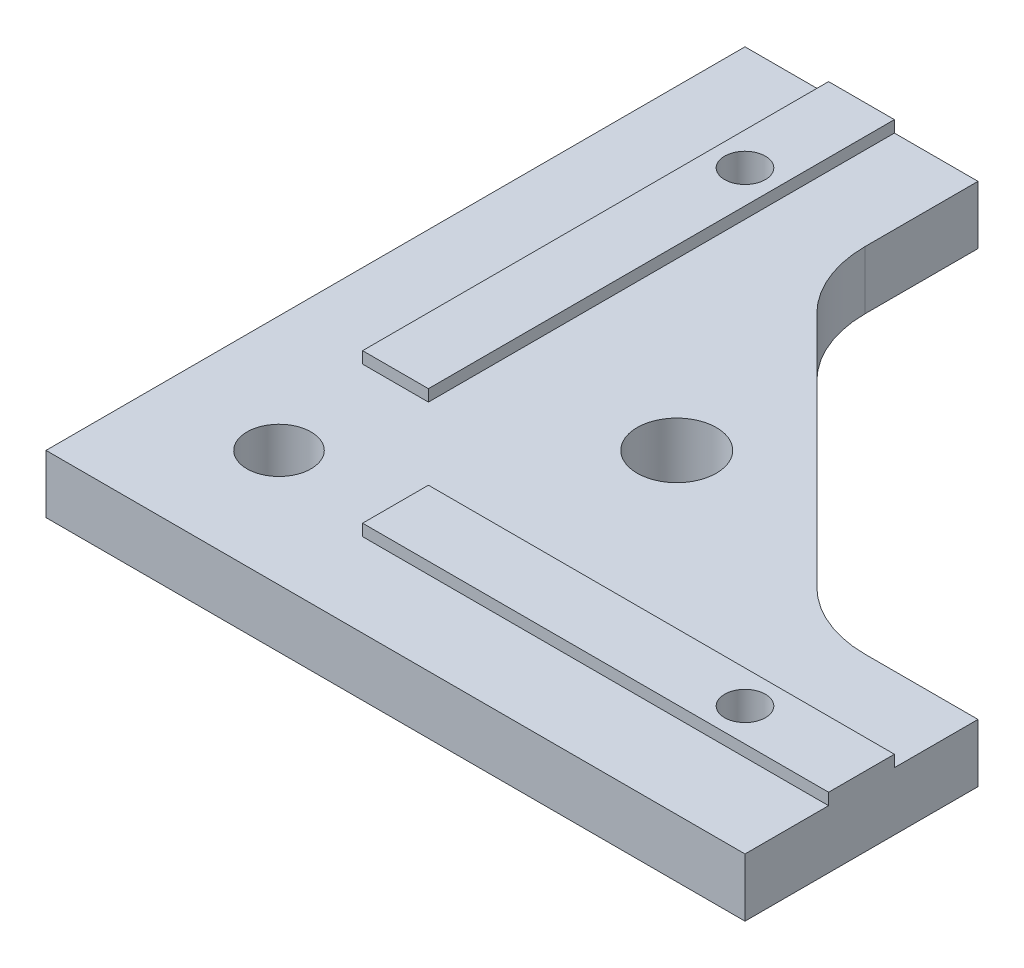
ISO-10303-21;
HEADER;
FILE_DESCRIPTION(('STEP AP214'),'2;1');
FILE_NAME('part.step','',(''),(''),'','','');
FILE_SCHEMA(('AUTOMOTIVE_DESIGN { 1 0 10303 214 1 1 1 1 }'));
ENDSEC;
DATA;
#1=APPLICATION_CONTEXT('core data for automotive mechanical design processes');
#2=APPLICATION_PROTOCOL_DEFINITION('international standard','automotive_design',2000,#1);
#3=PRODUCT_CONTEXT('',#1,'mechanical');
#4=PRODUCT('Part','Part','',(#3));
#5=PRODUCT_RELATED_PRODUCT_CATEGORY('part','',(#4));
#6=PRODUCT_DEFINITION_FORMATION('','',#4);
#7=PRODUCT_DEFINITION_CONTEXT('part definition',#1,'design');
#8=PRODUCT_DEFINITION('design','',#6,#7);
#9=PRODUCT_DEFINITION_SHAPE('','',#8);
#10=(LENGTH_UNIT() NAMED_UNIT(*) SI_UNIT(.MILLI.,.METRE.));
#11=(NAMED_UNIT(*) PLANE_ANGLE_UNIT() SI_UNIT($,.RADIAN.));
#12=(NAMED_UNIT(*) SI_UNIT($,.STERADIAN.) SOLID_ANGLE_UNIT());
#13=UNCERTAINTY_MEASURE_WITH_UNIT(LENGTH_MEASURE(1.E-05),#10,'distance_accuracy_value','');
#14=(GEOMETRIC_REPRESENTATION_CONTEXT(3) GLOBAL_UNCERTAINTY_ASSIGNED_CONTEXT((#13)) GLOBAL_UNIT_ASSIGNED_CONTEXT((#10,
#11,#12)) REPRESENTATION_CONTEXT('',''));
#15=CARTESIAN_POINT('',(0.,0.,0.));
#16=DIRECTION('',(0.,0.,1.));
#17=DIRECTION('',(1.,0.,0.));
#18=AXIS2_PLACEMENT_3D('',#15,#16,#17);
#19=CARTESIAN_POINT('',(0.,5.,0.));
#20=DIRECTION('',(0.,1.,0.));
#21=DIRECTION('',(0.,0.,1.));
#22=AXIS2_PLACEMENT_3D('',#19,#20,#21);
#23=PLANE('',#22);
#24=DIRECTION('',(1.,0.,0.));
#25=VECTOR('',#24,1.);
#26=CARTESIAN_POINT('',(0.,5.,-20.));
#27=LINE('',#26,#25);
#28=CARTESIAN_POINT('',(50.3050865276332,5.,-20.));
#29=VERTEX_POINT('',#28);
#30=CARTESIAN_POINT('',(60.,5.,-20.));
#31=VERTEX_POINT('',#30);
#32=EDGE_CURVE('E219',#29,#31,#27,.T.);
#33=ORIENTED_EDGE('',*,*,#32,.F.);
#34=CARTESIAN_POINT('',(50.3050865276332,5.,-30.));
#35=DIRECTION('',(0.,1.,0.));
#36=DIRECTION('',(0.,0.,1.));
#37=AXIS2_PLACEMENT_3D('',#34,#35,#36);
#38=CIRCLE('',#37,10.);
#39=CARTESIAN_POINT('',(43.2340187157677,5.,-22.9289321881345));
#40=VERTEX_POINT('',#39);
#41=EDGE_CURVE('E284',#29,#40,#38,.F.);
#42=ORIENTED_EDGE('',*,*,#41,.T.);
#43=DIRECTION('',(0.707106781186548,0.,0.707106781186548));
#44=VECTOR('',#43,1.);
#45=CARTESIAN_POINT('',(33.0814754519511,5.,-33.0814754519511));
#46=LINE('',#45,#44);
#47=CARTESIAN_POINT('',(22.9289321881345,5.,-43.2340187157677));
#48=VERTEX_POINT('',#47);
#49=EDGE_CURVE('E409',#48,#40,#46,.T.);
#50=ORIENTED_EDGE('',*,*,#49,.F.);
#51=CARTESIAN_POINT('',(30.,5.,-50.3050865276332));
#52=DIRECTION('',(0.,1.,0.));
#53=DIRECTION('',(0.,0.,1.));
#54=AXIS2_PLACEMENT_3D('',#51,#52,#53);
#55=CIRCLE('',#54,10.);
#56=CARTESIAN_POINT('',(20.,5.,-50.3050865276332));
#57=VERTEX_POINT('',#56);
#58=EDGE_CURVE('E11',#48,#57,#55,.F.);
#59=ORIENTED_EDGE('',*,*,#58,.T.);
#60=DIRECTION('',(0.,0.,1.));
#61=VECTOR('',#60,1.);
#62=CARTESIAN_POINT('',(20.,5.,0.));
#63=LINE('',#62,#61);
#64=CARTESIAN_POINT('',(20.,5.,-60.));
#65=VERTEX_POINT('',#64);
#66=EDGE_CURVE('E222',#65,#57,#63,.T.);
#67=ORIENTED_EDGE('',*,*,#66,.F.);
#68=DIRECTION('',(1.,0.,0.));
#69=VECTOR('',#68,1.);
#70=CARTESIAN_POINT('',(0.,5.,-60.));
#71=LINE('',#70,#69);
#72=CARTESIAN_POINT('',(12.825,5.,-60.));
#73=VERTEX_POINT('',#72);
#74=EDGE_CURVE('E224',#73,#65,#71,.T.);
#75=ORIENTED_EDGE('',*,*,#74,.F.);
#76=DIRECTION('',(0.,0.,1.));
#77=VECTOR('',#76,1.);
#78=CARTESIAN_POINT('',(12.825,5.,0.));
#79=LINE('',#78,#77);
#80=CARTESIAN_POINT('',(12.825,5.,-20.));
#81=VERTEX_POINT('',#80);
#82=EDGE_CURVE('E178',#73,#81,#79,.T.);
#83=ORIENTED_EDGE('',*,*,#82,.T.);
#84=DIRECTION('',(1.,0.,0.));
#85=VECTOR('',#84,1.);
#86=CARTESIAN_POINT('',(0.,5.,-20.));
#87=LINE('',#86,#85);
#88=CARTESIAN_POINT('',(7.17499999999999,5.,-20.));
#89=VERTEX_POINT('',#88);
#90=EDGE_CURVE('E190',#89,#81,#87,.T.);
#91=ORIENTED_EDGE('',*,*,#90,.F.);
#92=DIRECTION('',(0.,0.,1.));
#93=VECTOR('',#92,1.);
#94=CARTESIAN_POINT('',(7.17499999999999,5.,0.));
#95=LINE('',#94,#93);
#96=CARTESIAN_POINT('',(7.17499999999999,5.,-60.));
#97=VERTEX_POINT('',#96);
#98=EDGE_CURVE('E180',#97,#89,#95,.T.);
#99=ORIENTED_EDGE('',*,*,#98,.F.);
#100=CARTESIAN_POINT('',(0.,5.,-60.));
#101=VERTEX_POINT('',#100);
#102=EDGE_CURVE('E225',#101,#97,#71,.T.);
#103=ORIENTED_EDGE('',*,*,#102,.F.);
#104=DIRECTION('',(0.,0.,-1.));
#105=VECTOR('',#104,1.);
#106=CARTESIAN_POINT('',(0.,5.,0.));
#107=LINE('',#106,#105);
#108=CARTESIAN_POINT('',(0.,5.,0.));
#109=VERTEX_POINT('',#108);
#110=EDGE_CURVE('E228',#109,#101,#107,.T.);
#111=ORIENTED_EDGE('',*,*,#110,.F.);
#112=DIRECTION('',(-1.,0.,0.));
#113=VECTOR('',#112,1.);
#114=CARTESIAN_POINT('',(0.,5.,0.));
#115=LINE('',#114,#113);
#116=CARTESIAN_POINT('',(60.,5.,0.));
#117=VERTEX_POINT('',#116);
#118=EDGE_CURVE('E231',#117,#109,#115,.T.);
#119=ORIENTED_EDGE('',*,*,#118,.F.);
#120=DIRECTION('',(0.,0.,1.));
#121=VECTOR('',#120,1.);
#122=CARTESIAN_POINT('',(60.,5.,0.));
#123=LINE('',#122,#121);
#124=CARTESIAN_POINT('',(60.,5.,-7.17499999999999));
#125=VERTEX_POINT('',#124);
#126=EDGE_CURVE('E234',#125,#117,#123,.T.);
#127=ORIENTED_EDGE('',*,*,#126,.F.);
#128=DIRECTION('',(1.,0.,0.));
#129=VECTOR('',#128,1.);
#130=CARTESIAN_POINT('',(0.,5.,-7.17499999999999));
#131=LINE('',#130,#129);
#132=CARTESIAN_POINT('',(20.,5.,-7.17499999999999));
#133=VERTEX_POINT('',#132);
#134=EDGE_CURVE('E332',#133,#125,#131,.T.);
#135=ORIENTED_EDGE('',*,*,#134,.F.);
#136=DIRECTION('',(0.,0.,1.));
#137=VECTOR('',#136,1.);
#138=CARTESIAN_POINT('',(20.,5.,0.));
#139=LINE('',#138,#137);
#140=CARTESIAN_POINT('',(20.,5.,-12.825));
#141=VERTEX_POINT('',#140);
#142=EDGE_CURVE('E176',#141,#133,#139,.T.);
#143=ORIENTED_EDGE('',*,*,#142,.F.);
#144=DIRECTION('',(1.,0.,0.));
#145=VECTOR('',#144,1.);
#146=CARTESIAN_POINT('',(0.,5.,-12.825));
#147=LINE('',#146,#145);
#148=CARTESIAN_POINT('',(60.,5.,-12.825));
#149=VERTEX_POINT('',#148);
#150=EDGE_CURVE('E337',#141,#149,#147,.T.);
#151=ORIENTED_EDGE('',*,*,#150,.T.);
#152=EDGE_CURVE('E235',#31,#149,#123,.T.);
#153=ORIENTED_EDGE('',*,*,#152,.F.);
#154=EDGE_LOOP('',(#33,#42,#50,#59,#67,#75,#83,#91,#99,#103,#111,#119,#127,#135,#143,#151,#153));
#155=FACE_BOUND('',#154,.T.);
#156=CARTESIAN_POINT('',(10.,5.,-10.));
#157=DIRECTION('',(0.,1.,0.));
#158=DIRECTION('',(0.,0.,1.));
#159=AXIS2_PLACEMENT_3D('',#156,#157,#158);
#160=CIRCLE('',#159,2.75);
#161=CARTESIAN_POINT('',(10.,5.,-7.25));
#162=VERTEX_POINT('',#161);
#163=EDGE_CURVE('E216',#162,#162,#160,.T.);
#164=ORIENTED_EDGE('',*,*,#163,.F.);
#165=EDGE_LOOP('',(#164));
#166=FACE_BOUND('',#165,.T.);
#167=CARTESIAN_POINT('',(27.0710678118655,5.,-27.0710678118655));
#168=DIRECTION('',(0.,1.,0.));
#169=DIRECTION('',(0.,0.,1.));
#170=AXIS2_PLACEMENT_3D('',#167,#168,#169);
#171=CIRCLE('',#170,3.4);
#172=CARTESIAN_POINT('',(27.0710678118655,5.,-23.6710678118655));
#173=VERTEX_POINT('',#172);
#174=EDGE_CURVE('E296',#173,#173,#171,.F.);
#175=ORIENTED_EDGE('',*,*,#174,.T.);
#176=EDGE_LOOP('',(#175));
#177=FACE_BOUND('',#176,.T.);
#178=ADVANCED_FACE('F35',(#155,#166,#177),#23,.T.);
#179=CARTESIAN_POINT('',(0.,5.,-20.));
#180=DIRECTION('',(0.,0.,-1.));
#181=DIRECTION('',(-1.,0.,0.));
#182=AXIS2_PLACEMENT_3D('',#179,#180,#181);
#183=PLANE('',#182);
#184=DIRECTION('',(1.,0.,0.));
#185=VECTOR('',#184,1.);
#186=CARTESIAN_POINT('',(0.,0.,-20.));
#187=LINE('',#186,#185);
#188=CARTESIAN_POINT('',(50.3050865276332,0.,-20.));
#189=VERTEX_POINT('',#188);
#190=CARTESIAN_POINT('',(60.,0.,-20.));
#191=VERTEX_POINT('',#190);
#192=EDGE_CURVE('E247',#189,#191,#187,.T.);
#193=ORIENTED_EDGE('',*,*,#192,.F.);
#194=DIRECTION('',(0.,-1.,0.));
#195=VECTOR('',#194,1.);
#196=CARTESIAN_POINT('',(50.3050865276332,5.,-20.));
#197=LINE('',#196,#195);
#198=EDGE_CURVE('E278',#189,#29,#197,.F.);
#199=ORIENTED_EDGE('',*,*,#198,.T.);
#200=ORIENTED_EDGE('',*,*,#32,.T.);
#201=DIRECTION('',(0.,-1.,0.));
#202=VECTOR('',#201,1.);
#203=CARTESIAN_POINT('',(60.,5.,-20.));
#204=LINE('',#203,#202);
#205=EDGE_CURVE('E238',#31,#191,#204,.T.);
#206=ORIENTED_EDGE('',*,*,#205,.T.);
#207=EDGE_LOOP('',(#193,#199,#200,#206));
#208=FACE_BOUND('',#207,.T.);
#209=ADVANCED_FACE('F352',(#208),#183,.T.);
#210=CARTESIAN_POINT('',(20.,5.,0.));
#211=DIRECTION('',(1.,0.,0.));
#212=DIRECTION('',(0.,0.,-1.));
#213=AXIS2_PLACEMENT_3D('',#210,#211,#212);
#214=PLANE('',#213);
#215=ORIENTED_EDGE('',*,*,#66,.T.);
#216=DIRECTION('',(0.,-1.,0.));
#217=VECTOR('',#216,1.);
#218=CARTESIAN_POINT('',(20.,0.,-50.3050865276332));
#219=LINE('',#218,#217);
#220=CARTESIAN_POINT('',(20.,0.,-50.3050865276332));
#221=VERTEX_POINT('',#220);
#222=EDGE_CURVE('E280',#57,#221,#219,.T.);
#223=ORIENTED_EDGE('',*,*,#222,.T.);
#224=DIRECTION('',(0.,0.,1.));
#225=VECTOR('',#224,1.);
#226=CARTESIAN_POINT('',(20.,0.,0.));
#227=LINE('',#226,#225);
#228=CARTESIAN_POINT('',(20.,0.,-60.));
#229=VERTEX_POINT('',#228);
#230=EDGE_CURVE('E249',#229,#221,#227,.T.);
#231=ORIENTED_EDGE('',*,*,#230,.F.);
#232=DIRECTION('',(0.,-1.,0.));
#233=VECTOR('',#232,1.);
#234=CARTESIAN_POINT('',(20.,5.,-60.));
#235=LINE('',#234,#233);
#236=EDGE_CURVE('E271',#65,#229,#235,.T.);
#237=ORIENTED_EDGE('',*,*,#236,.F.);
#238=EDGE_LOOP('',(#215,#223,#231,#237));
#239=FACE_BOUND('',#238,.T.);
#240=ADVANCED_FACE('F300',(#239),#214,.T.);
#241=CARTESIAN_POINT('',(0.,5.,-60.));
#242=DIRECTION('',(0.,0.,-1.));
#243=DIRECTION('',(-1.,0.,0.));
#244=AXIS2_PLACEMENT_3D('',#241,#242,#243);
#245=PLANE('',#244);
#246=DIRECTION('',(1.,0.,0.));
#247=VECTOR('',#246,1.);
#248=CARTESIAN_POINT('',(0.,0.,-60.));
#249=LINE('',#248,#247);
#250=CARTESIAN_POINT('',(0.,0.,-60.));
#251=VERTEX_POINT('',#250);
#252=EDGE_CURVE('E252',#251,#229,#249,.T.);
#253=ORIENTED_EDGE('',*,*,#252,.F.);
#254=DIRECTION('',(0.,-1.,0.));
#255=VECTOR('',#254,1.);
#256=CARTESIAN_POINT('',(0.,5.,-60.));
#257=LINE('',#256,#255);
#258=EDGE_CURVE('E269',#101,#251,#257,.T.);
#259=ORIENTED_EDGE('',*,*,#258,.F.);
#260=ORIENTED_EDGE('',*,*,#102,.T.);
#261=DIRECTION('',(0.,-1.,0.));
#262=VECTOR('',#261,1.);
#263=CARTESIAN_POINT('',(7.17499999999999,6.,-60.));
#264=LINE('',#263,#262);
#265=CARTESIAN_POINT('',(7.17499999999999,6.,-60.));
#266=VERTEX_POINT('',#265);
#267=EDGE_CURVE('E209',#266,#97,#264,.T.);
#268=ORIENTED_EDGE('',*,*,#267,.F.);
#269=DIRECTION('',(-1.,0.,0.));
#270=VECTOR('',#269,1.);
#271=CARTESIAN_POINT('',(0.,6.,-60.));
#272=LINE('',#271,#270);
#273=CARTESIAN_POINT('',(12.825,6.,-60.));
#274=VERTEX_POINT('',#273);
#275=EDGE_CURVE('E189',#274,#266,#272,.T.);
#276=ORIENTED_EDGE('',*,*,#275,.F.);
#277=DIRECTION('',(0.,-1.,0.));
#278=VECTOR('',#277,1.);
#279=CARTESIAN_POINT('',(12.825,6.,-60.));
#280=LINE('',#279,#278);
#281=EDGE_CURVE('E212',#274,#73,#280,.T.);
#282=ORIENTED_EDGE('',*,*,#281,.T.);
#283=ORIENTED_EDGE('',*,*,#74,.T.);
#284=ORIENTED_EDGE('',*,*,#236,.T.);
#285=EDGE_LOOP('',(#253,#259,#260,#268,#276,#282,#283,#284));
#286=FACE_BOUND('',#285,.T.);
#287=ADVANCED_FACE('F308',(#286),#245,.T.);
#288=CARTESIAN_POINT('',(0.,5.,0.));
#289=DIRECTION('',(-1.,0.,0.));
#290=DIRECTION('',(0.,0.,1.));
#291=AXIS2_PLACEMENT_3D('',#288,#289,#290);
#292=PLANE('',#291);
#293=DIRECTION('',(0.,0.,-1.));
#294=VECTOR('',#293,1.);
#295=CARTESIAN_POINT('',(0.,0.,0.));
#296=LINE('',#295,#294);
#297=CARTESIAN_POINT('',(0.,0.,0.));
#298=VERTEX_POINT('',#297);
#299=EDGE_CURVE('E255',#298,#251,#296,.T.);
#300=ORIENTED_EDGE('',*,*,#299,.F.);
#301=DIRECTION('',(0.,-1.,0.));
#302=VECTOR('',#301,1.);
#303=CARTESIAN_POINT('',(0.,5.,0.));
#304=LINE('',#303,#302);
#305=EDGE_CURVE('E267',#109,#298,#304,.T.);
#306=ORIENTED_EDGE('',*,*,#305,.F.);
#307=ORIENTED_EDGE('',*,*,#110,.T.);
#308=ORIENTED_EDGE('',*,*,#258,.T.);
#309=EDGE_LOOP('',(#300,#306,#307,#308));
#310=FACE_BOUND('',#309,.T.);
#311=ADVANCED_FACE('F326',(#310),#292,.T.);
#312=CARTESIAN_POINT('',(0.,5.,0.));
#313=DIRECTION('',(0.,0.,1.));
#314=DIRECTION('',(1.,0.,0.));
#315=AXIS2_PLACEMENT_3D('',#312,#313,#314);
#316=PLANE('',#315);
#317=DIRECTION('',(-1.,0.,0.));
#318=VECTOR('',#317,1.);
#319=CARTESIAN_POINT('',(0.,0.,0.));
#320=LINE('',#319,#318);
#321=CARTESIAN_POINT('',(60.,0.,0.));
#322=VERTEX_POINT('',#321);
#323=EDGE_CURVE('E258',#322,#298,#320,.T.);
#324=ORIENTED_EDGE('',*,*,#323,.F.);
#325=DIRECTION('',(0.,-1.,0.));
#326=VECTOR('',#325,1.);
#327=CARTESIAN_POINT('',(60.,5.,0.));
#328=LINE('',#327,#326);
#329=EDGE_CURVE('E265',#117,#322,#328,.T.);
#330=ORIENTED_EDGE('',*,*,#329,.F.);
#331=ORIENTED_EDGE('',*,*,#118,.T.);
#332=ORIENTED_EDGE('',*,*,#305,.T.);
#333=EDGE_LOOP('',(#324,#330,#331,#332));
#334=FACE_BOUND('',#333,.T.);
#335=ADVANCED_FACE('F329',(#334),#316,.T.);
#336=CARTESIAN_POINT('',(9.99999999999999,5.,-50.));
#337=DIRECTION('',(0.,-1.,0.));
#338=DIRECTION('',(0.,0.,-1.));
#339=AXIS2_PLACEMENT_3D('',#336,#337,#338);
#340=CYLINDRICAL_SURFACE('',#339,1.75);
#341=CARTESIAN_POINT('',(9.99999999999999,0.,-50.));
#342=DIRECTION('',(0.,1.,0.));
#343=DIRECTION('',(0.,0.,1.));
#344=AXIS2_PLACEMENT_3D('',#341,#342,#343);
#345=CIRCLE('',#344,1.75);
#346=CARTESIAN_POINT('',(9.99999999999999,0.,-48.25));
#347=VERTEX_POINT('',#346);
#348=EDGE_CURVE('E244',#347,#347,#345,.T.);
#349=ORIENTED_EDGE('',*,*,#348,.F.);
#350=EDGE_LOOP('',(#349));
#351=FACE_BOUND('',#350,.T.);
#352=CARTESIAN_POINT('',(9.99999999999999,6.,-50.));
#353=DIRECTION('',(0.,1.,0.));
#354=DIRECTION('',(0.,0.,1.));
#355=AXIS2_PLACEMENT_3D('',#352,#353,#354);
#356=CIRCLE('',#355,1.75);
#357=CARTESIAN_POINT('',(9.99999999999999,6.,-48.25));
#358=VERTEX_POINT('',#357);
#359=EDGE_CURVE('E196',#358,#358,#356,.F.);
#360=ORIENTED_EDGE('',*,*,#359,.F.);
#361=EDGE_LOOP('',(#360));
#362=FACE_BOUND('',#361,.T.);
#363=ADVANCED_FACE('F382',(#351,#362),#340,.F.);
#364=CARTESIAN_POINT('',(50.,5.,-10.));
#365=DIRECTION('',(0.,-1.,0.));
#366=DIRECTION('',(0.,0.,-1.));
#367=AXIS2_PLACEMENT_3D('',#364,#365,#366);
#368=CYLINDRICAL_SURFACE('',#367,1.75);
#369=CARTESIAN_POINT('',(50.,0.,-10.));
#370=DIRECTION('',(0.,1.,0.));
#371=DIRECTION('',(0.,0.,1.));
#372=AXIS2_PLACEMENT_3D('',#369,#370,#371);
#373=CIRCLE('',#372,1.75);
#374=CARTESIAN_POINT('',(50.,0.,-8.24999999999999));
#375=VERTEX_POINT('',#374);
#376=EDGE_CURVE('E241',#375,#375,#373,.T.);
#377=ORIENTED_EDGE('',*,*,#376,.F.);
#378=EDGE_LOOP('',(#377));
#379=FACE_BOUND('',#378,.T.);
#380=CARTESIAN_POINT('',(50.,6.,-10.));
#381=DIRECTION('',(0.,1.,0.));
#382=DIRECTION('',(0.,0.,1.));
#383=AXIS2_PLACEMENT_3D('',#380,#381,#382);
#384=CIRCLE('',#383,1.75);
#385=CARTESIAN_POINT('',(50.,6.,-8.24999999999999));
#386=VERTEX_POINT('',#385);
#387=EDGE_CURVE('E172',#386,#386,#384,.F.);
#388=ORIENTED_EDGE('',*,*,#387,.F.);
#389=EDGE_LOOP('',(#388));
#390=FACE_BOUND('',#389,.T.);
#391=ADVANCED_FACE('F391',(#379,#390),#368,.F.);
#392=CARTESIAN_POINT('',(10.,5.,-10.));
#393=DIRECTION('',(0.,-1.,0.));
#394=DIRECTION('',(0.,0.,-1.));
#395=AXIS2_PLACEMENT_3D('',#392,#393,#394);
#396=CYLINDRICAL_SURFACE('',#395,2.75);
#397=ORIENTED_EDGE('',*,*,#163,.T.);
#398=EDGE_LOOP('',(#397));
#399=FACE_BOUND('',#398,.T.);
#400=CARTESIAN_POINT('',(10.,0.,-10.));
#401=DIRECTION('',(0.,1.,0.));
#402=DIRECTION('',(0.,0.,1.));
#403=AXIS2_PLACEMENT_3D('',#400,#401,#402);
#404=CIRCLE('',#403,2.75);
#405=CARTESIAN_POINT('',(10.,0.,-7.25));
#406=VERTEX_POINT('',#405);
#407=EDGE_CURVE('E215',#406,#406,#404,.T.);
#408=ORIENTED_EDGE('',*,*,#407,.F.);
#409=EDGE_LOOP('',(#408));
#410=FACE_BOUND('',#409,.T.);
#411=ADVANCED_FACE('F379',(#399,#410),#396,.F.);
#412=CARTESIAN_POINT('',(60.,5.,0.));
#413=DIRECTION('',(1.,0.,0.));
#414=DIRECTION('',(0.,0.,-1.));
#415=AXIS2_PLACEMENT_3D('',#412,#413,#414);
#416=PLANE('',#415);
#417=DIRECTION('',(0.,0.,1.));
#418=VECTOR('',#417,1.);
#419=CARTESIAN_POINT('',(60.,0.,0.));
#420=LINE('',#419,#418);
#421=EDGE_CURVE('E220',#191,#322,#420,.T.);
#422=ORIENTED_EDGE('',*,*,#421,.F.);
#423=ORIENTED_EDGE('',*,*,#205,.F.);
#424=ORIENTED_EDGE('',*,*,#152,.T.);
#425=DIRECTION('',(0.,-1.,0.));
#426=VECTOR('',#425,1.);
#427=CARTESIAN_POINT('',(60.,6.,-12.825));
#428=LINE('',#427,#426);
#429=CARTESIAN_POINT('',(60.,6.,-12.825));
#430=VERTEX_POINT('',#429);
#431=EDGE_CURVE('E182',#430,#149,#428,.T.);
#432=ORIENTED_EDGE('',*,*,#431,.F.);
#433=DIRECTION('',(0.,0.,-1.));
#434=VECTOR('',#433,1.);
#435=CARTESIAN_POINT('',(60.,6.,0.));
#436=LINE('',#435,#434);
#437=CARTESIAN_POINT('',(60.,6.,-7.17499999999999));
#438=VERTEX_POINT('',#437);
#439=EDGE_CURVE('E163',#438,#430,#436,.T.);
#440=ORIENTED_EDGE('',*,*,#439,.F.);
#441=DIRECTION('',(0.,-1.,0.));
#442=VECTOR('',#441,1.);
#443=CARTESIAN_POINT('',(60.,6.,-7.17499999999999));
#444=LINE('',#443,#442);
#445=EDGE_CURVE('E160',#438,#125,#444,.T.);
#446=ORIENTED_EDGE('',*,*,#445,.T.);
#447=ORIENTED_EDGE('',*,*,#126,.T.);
#448=ORIENTED_EDGE('',*,*,#329,.T.);
#449=EDGE_LOOP('',(#422,#423,#424,#432,#440,#446,#447,#448));
#450=FACE_BOUND('',#449,.T.);
#451=ADVANCED_FACE('F335',(#450),#416,.T.);
#452=CARTESIAN_POINT('',(0.,0.,0.));
#453=DIRECTION('',(0.,1.,0.));
#454=DIRECTION('',(0.,0.,1.));
#455=AXIS2_PLACEMENT_3D('',#452,#453,#454);
#456=PLANE('',#455);
#457=ORIENTED_EDGE('',*,*,#230,.T.);
#458=CARTESIAN_POINT('',(30.,0.,-50.3050865276332));
#459=DIRECTION('',(0.,1.,0.));
#460=DIRECTION('',(0.,0.,1.));
#461=AXIS2_PLACEMENT_3D('',#458,#459,#460);
#462=CIRCLE('',#461,10.);
#463=CARTESIAN_POINT('',(22.9289321881345,0.,-43.2340187157677));
#464=VERTEX_POINT('',#463);
#465=EDGE_CURVE('E43',#221,#464,#462,.T.);
#466=ORIENTED_EDGE('',*,*,#465,.T.);
#467=DIRECTION('',(0.707106781186547,0.,0.707106781186548));
#468=VECTOR('',#467,1.);
#469=CARTESIAN_POINT('',(33.0814754519511,0.,-33.0814754519511));
#470=LINE('',#469,#468);
#471=CARTESIAN_POINT('',(43.2340187157677,0.,-22.9289321881345));
#472=VERTEX_POINT('',#471);
#473=EDGE_CURVE('E290',#464,#472,#470,.T.);
#474=ORIENTED_EDGE('',*,*,#473,.T.);
#475=CARTESIAN_POINT('',(50.3050865276332,0.,-30.));
#476=DIRECTION('',(0.,1.,0.));
#477=DIRECTION('',(0.,0.,1.));
#478=AXIS2_PLACEMENT_3D('',#475,#476,#477);
#479=CIRCLE('',#478,10.);
#480=EDGE_CURVE('E282',#472,#189,#479,.T.);
#481=ORIENTED_EDGE('',*,*,#480,.T.);
#482=ORIENTED_EDGE('',*,*,#192,.T.);
#483=ORIENTED_EDGE('',*,*,#421,.T.);
#484=ORIENTED_EDGE('',*,*,#323,.T.);
#485=ORIENTED_EDGE('',*,*,#299,.T.);
#486=ORIENTED_EDGE('',*,*,#252,.T.);
#487=EDGE_LOOP('',(#457,#466,#474,#481,#482,#483,#484,#485,#486));
#488=FACE_BOUND('',#487,.T.);
#489=ORIENTED_EDGE('',*,*,#407,.T.);
#490=EDGE_LOOP('',(#489));
#491=FACE_BOUND('',#490,.T.);
#492=ORIENTED_EDGE('',*,*,#376,.T.);
#493=EDGE_LOOP('',(#492));
#494=FACE_BOUND('',#493,.T.);
#495=ORIENTED_EDGE('',*,*,#348,.T.);
#496=EDGE_LOOP('',(#495));
#497=FACE_BOUND('',#496,.T.);
#498=CARTESIAN_POINT('',(27.0710678118655,0.,-27.0710678118655));
#499=DIRECTION('',(0.,-1.,0.));
#500=DIRECTION('',(0.,0.,-1.));
#501=AXIS2_PLACEMENT_3D('',#498,#499,#500);
#502=CIRCLE('',#501,3.4);
#503=CARTESIAN_POINT('',(27.0710678118655,0.,-30.4710678118655));
#504=VERTEX_POINT('',#503);
#505=EDGE_CURVE('E297',#504,#504,#502,.T.);
#506=ORIENTED_EDGE('',*,*,#505,.F.);
#507=EDGE_LOOP('',(#506));
#508=FACE_BOUND('',#507,.T.);
#509=ADVANCED_FACE('F288',(#488,#491,#494,#497,#508),#456,.F.);
#510=CARTESIAN_POINT('',(12.825,6.,0.));
#511=DIRECTION('',(1.,0.,0.));
#512=DIRECTION('',(0.,0.,-1.));
#513=AXIS2_PLACEMENT_3D('',#510,#511,#512);
#514=PLANE('',#513);
#515=ORIENTED_EDGE('',*,*,#82,.F.);
#516=ORIENTED_EDGE('',*,*,#281,.F.);
#517=DIRECTION('',(0.,0.,1.));
#518=VECTOR('',#517,1.);
#519=CARTESIAN_POINT('',(12.825,6.,0.));
#520=LINE('',#519,#518);
#521=CARTESIAN_POINT('',(12.825,6.,-20.));
#522=VERTEX_POINT('',#521);
#523=EDGE_CURVE('E186',#274,#522,#520,.T.);
#524=ORIENTED_EDGE('',*,*,#523,.T.);
#525=DIRECTION('',(0.,-1.,0.));
#526=VECTOR('',#525,1.);
#527=CARTESIAN_POINT('',(12.825,6.,-20.));
#528=LINE('',#527,#526);
#529=EDGE_CURVE('E198',#522,#81,#528,.T.);
#530=ORIENTED_EDGE('',*,*,#529,.T.);
#531=EDGE_LOOP('',(#515,#516,#524,#530));
#532=FACE_BOUND('',#531,.T.);
#533=ADVANCED_FACE('F312',(#532),#514,.T.);
#534=CARTESIAN_POINT('',(7.17499999999999,6.,0.));
#535=DIRECTION('',(1.,0.,0.));
#536=DIRECTION('',(0.,0.,-1.));
#537=AXIS2_PLACEMENT_3D('',#534,#535,#536);
#538=PLANE('',#537);
#539=ORIENTED_EDGE('',*,*,#98,.T.);
#540=DIRECTION('',(0.,-1.,0.));
#541=VECTOR('',#540,1.);
#542=CARTESIAN_POINT('',(7.17499999999999,6.,-20.));
#543=LINE('',#542,#541);
#544=CARTESIAN_POINT('',(7.17499999999999,6.,-20.));
#545=VERTEX_POINT('',#544);
#546=EDGE_CURVE('E206',#545,#89,#543,.T.);
#547=ORIENTED_EDGE('',*,*,#546,.F.);
#548=DIRECTION('',(0.,0.,1.));
#549=VECTOR('',#548,1.);
#550=CARTESIAN_POINT('',(7.17499999999999,6.,0.));
#551=LINE('',#550,#549);
#552=EDGE_CURVE('E192',#266,#545,#551,.T.);
#553=ORIENTED_EDGE('',*,*,#552,.F.);
#554=ORIENTED_EDGE('',*,*,#267,.T.);
#555=EDGE_LOOP('',(#539,#547,#553,#554));
#556=FACE_BOUND('',#555,.T.);
#557=ADVANCED_FACE('F320',(#556),#538,.F.);
#558=CARTESIAN_POINT('',(0.,6.,-20.));
#559=DIRECTION('',(0.,0.,-1.));
#560=DIRECTION('',(-1.,0.,0.));
#561=AXIS2_PLACEMENT_3D('',#558,#559,#560);
#562=PLANE('',#561);
#563=ORIENTED_EDGE('',*,*,#90,.T.);
#564=ORIENTED_EDGE('',*,*,#529,.F.);
#565=DIRECTION('',(1.,0.,0.));
#566=VECTOR('',#565,1.);
#567=CARTESIAN_POINT('',(0.,6.,-20.));
#568=LINE('',#567,#566);
#569=EDGE_CURVE('E194',#545,#522,#568,.T.);
#570=ORIENTED_EDGE('',*,*,#569,.F.);
#571=ORIENTED_EDGE('',*,*,#546,.T.);
#572=EDGE_LOOP('',(#563,#564,#570,#571));
#573=FACE_BOUND('',#572,.T.);
#574=ADVANCED_FACE('F316',(#573),#562,.F.);
#575=CARTESIAN_POINT('',(0.,6.,0.));
#576=DIRECTION('',(0.,1.,0.));
#577=DIRECTION('',(0.,0.,1.));
#578=AXIS2_PLACEMENT_3D('',#575,#576,#577);
#579=PLANE('',#578);
#580=ORIENTED_EDGE('',*,*,#523,.F.);
#581=ORIENTED_EDGE('',*,*,#275,.T.);
#582=ORIENTED_EDGE('',*,*,#552,.T.);
#583=ORIENTED_EDGE('',*,*,#569,.T.);
#584=EDGE_LOOP('',(#580,#581,#582,#583));
#585=FACE_BOUND('',#584,.T.);
#586=ORIENTED_EDGE('',*,*,#359,.T.);
#587=EDGE_LOOP('',(#586));
#588=FACE_BOUND('',#587,.T.);
#589=ADVANCED_FACE('F433',(#585,#588),#579,.T.);
#590=CARTESIAN_POINT('',(20.,6.,0.));
#591=DIRECTION('',(1.,0.,0.));
#592=DIRECTION('',(0.,0.,-1.));
#593=AXIS2_PLACEMENT_3D('',#590,#591,#592);
#594=PLANE('',#593);
#595=ORIENTED_EDGE('',*,*,#142,.T.);
#596=DIRECTION('',(0.,-1.,0.));
#597=VECTOR('',#596,1.);
#598=CARTESIAN_POINT('',(20.,6.,-7.17499999999999));
#599=LINE('',#598,#597);
#600=CARTESIAN_POINT('',(20.,6.,-7.17499999999999));
#601=VERTEX_POINT('',#600);
#602=EDGE_CURVE('E158',#601,#133,#599,.T.);
#603=ORIENTED_EDGE('',*,*,#602,.F.);
#604=DIRECTION('',(0.,0.,1.));
#605=VECTOR('',#604,1.);
#606=CARTESIAN_POINT('',(20.,6.,0.));
#607=LINE('',#606,#605);
#608=CARTESIAN_POINT('',(20.,6.,-12.825));
#609=VERTEX_POINT('',#608);
#610=EDGE_CURVE('E164',#609,#601,#607,.T.);
#611=ORIENTED_EDGE('',*,*,#610,.F.);
#612=DIRECTION('',(0.,-1.,0.));
#613=VECTOR('',#612,1.);
#614=CARTESIAN_POINT('',(20.,6.,-12.825));
#615=LINE('',#614,#613);
#616=EDGE_CURVE('E344',#609,#141,#615,.T.);
#617=ORIENTED_EDGE('',*,*,#616,.T.);
#618=EDGE_LOOP('',(#595,#603,#611,#617));
#619=FACE_BOUND('',#618,.T.);
#620=ADVANCED_FACE('F174',(#619),#594,.F.);
#621=CARTESIAN_POINT('',(0.,6.,-7.17499999999999));
#622=DIRECTION('',(0.,0.,-1.));
#623=DIRECTION('',(-1.,0.,0.));
#624=AXIS2_PLACEMENT_3D('',#621,#622,#623);
#625=PLANE('',#624);
#626=ORIENTED_EDGE('',*,*,#134,.T.);
#627=ORIENTED_EDGE('',*,*,#445,.F.);
#628=DIRECTION('',(1.,0.,0.));
#629=VECTOR('',#628,1.);
#630=CARTESIAN_POINT('',(0.,6.,-7.17499999999999));
#631=LINE('',#630,#629);
#632=EDGE_CURVE('E153',#601,#438,#631,.T.);
#633=ORIENTED_EDGE('',*,*,#632,.F.);
#634=ORIENTED_EDGE('',*,*,#602,.T.);
#635=EDGE_LOOP('',(#626,#627,#633,#634));
#636=FACE_BOUND('',#635,.T.);
#637=ADVANCED_FACE('F156',(#636),#625,.F.);
#638=CARTESIAN_POINT('',(0.,6.,-12.825));
#639=DIRECTION('',(0.,0.,-1.));
#640=DIRECTION('',(-1.,0.,0.));
#641=AXIS2_PLACEMENT_3D('',#638,#639,#640);
#642=PLANE('',#641);
#643=ORIENTED_EDGE('',*,*,#150,.F.);
#644=ORIENTED_EDGE('',*,*,#616,.F.);
#645=DIRECTION('',(1.,0.,0.));
#646=VECTOR('',#645,1.);
#647=CARTESIAN_POINT('',(0.,6.,-12.825));
#648=LINE('',#647,#646);
#649=EDGE_CURVE('E170',#609,#430,#648,.T.);
#650=ORIENTED_EDGE('',*,*,#649,.T.);
#651=ORIENTED_EDGE('',*,*,#431,.T.);
#652=EDGE_LOOP('',(#643,#644,#650,#651));
#653=FACE_BOUND('',#652,.T.);
#654=ADVANCED_FACE('F347',(#653),#642,.T.);
#655=CARTESIAN_POINT('',(0.,6.,0.));
#656=DIRECTION('',(0.,1.,0.));
#657=DIRECTION('',(0.,0.,1.));
#658=AXIS2_PLACEMENT_3D('',#655,#656,#657);
#659=PLANE('',#658);
#660=ORIENTED_EDGE('',*,*,#387,.T.);
#661=EDGE_LOOP('',(#660));
#662=FACE_BOUND('',#661,.T.);
#663=ORIENTED_EDGE('',*,*,#610,.T.);
#664=ORIENTED_EDGE('',*,*,#632,.T.);
#665=ORIENTED_EDGE('',*,*,#439,.T.);
#666=ORIENTED_EDGE('',*,*,#649,.F.);
#667=EDGE_LOOP('',(#663,#664,#665,#666));
#668=FACE_BOUND('',#667,.T.);
#669=ADVANCED_FACE('F168',(#662,#668),#659,.T.);
#670=CARTESIAN_POINT('',(33.0814754519511,42.,-33.0814754519511));
#671=DIRECTION('',(0.707106781186548,0.,-0.707106781186548));
#672=DIRECTION('',(-0.707106781186548,0.,-0.707106781186548));
#673=AXIS2_PLACEMENT_3D('',#670,#671,#672);
#674=PLANE('',#673);
#675=ORIENTED_EDGE('',*,*,#49,.T.);
#676=DIRECTION('',(0.,-1.,0.));
#677=VECTOR('',#676,1.);
#678=CARTESIAN_POINT('',(43.2340187157677,0.,-22.9289321881345));
#679=LINE('',#678,#677);
#680=EDGE_CURVE('E275',#40,#472,#679,.T.);
#681=ORIENTED_EDGE('',*,*,#680,.T.);
#682=ORIENTED_EDGE('',*,*,#473,.F.);
#683=DIRECTION('',(0.,-1.,0.));
#684=VECTOR('',#683,1.);
#685=CARTESIAN_POINT('',(22.9289321881345,5.,-43.2340187157677));
#686=LINE('',#685,#684);
#687=EDGE_CURVE('E273',#464,#48,#686,.F.);
#688=ORIENTED_EDGE('',*,*,#687,.T.);
#689=EDGE_LOOP('',(#675,#681,#682,#688));
#690=FACE_BOUND('',#689,.T.);
#691=ADVANCED_FACE('F294',(#690),#674,.T.);
#692=CARTESIAN_POINT('',(27.0710678118655,42.,-27.0710678118655));
#693=DIRECTION('',(0.,-1.,0.));
#694=DIRECTION('',(0.,0.,-1.));
#695=AXIS2_PLACEMENT_3D('',#692,#693,#694);
#696=CYLINDRICAL_SURFACE('',#695,3.4);
#697=ORIENTED_EDGE('',*,*,#505,.T.);
#698=EDGE_LOOP('',(#697));
#699=FACE_BOUND('',#698,.T.);
#700=ORIENTED_EDGE('',*,*,#174,.F.);
#701=EDGE_LOOP('',(#700));
#702=FACE_BOUND('',#701,.T.);
#703=ADVANCED_FACE('F358',(#699,#702),#696,.F.);
#704=CARTESIAN_POINT('',(50.3050865276332,42.,-30.));
#705=DIRECTION('',(0.,1.,0.));
#706=DIRECTION('',(0.,0.,1.));
#707=AXIS2_PLACEMENT_3D('',#704,#705,#706);
#708=CYLINDRICAL_SURFACE('',#707,10.);
#709=ORIENTED_EDGE('',*,*,#41,.F.);
#710=ORIENTED_EDGE('',*,*,#198,.F.);
#711=ORIENTED_EDGE('',*,*,#480,.F.);
#712=ORIENTED_EDGE('',*,*,#680,.F.);
#713=EDGE_LOOP('',(#709,#710,#711,#712));
#714=FACE_BOUND('',#713,.T.);
#715=ADVANCED_FACE('F356',(#714),#708,.F.);
#716=CARTESIAN_POINT('',(30.,5.,-50.3050865276332));
#717=DIRECTION('',(0.,1.,0.));
#718=DIRECTION('',(0.,0.,1.));
#719=AXIS2_PLACEMENT_3D('',#716,#717,#718);
#720=CYLINDRICAL_SURFACE('',#719,10.);
#721=ORIENTED_EDGE('',*,*,#58,.F.);
#722=ORIENTED_EDGE('',*,*,#687,.F.);
#723=ORIENTED_EDGE('',*,*,#465,.F.);
#724=ORIENTED_EDGE('',*,*,#222,.F.);
#725=EDGE_LOOP('',(#721,#722,#723,#724));
#726=FACE_BOUND('',#725,.T.);
#727=ADVANCED_FACE('F37',(#726),#720,.F.);
#728=CLOSED_SHELL('',(#178,#209,#240,#287,#311,#335,#363,#391,#411,#451,#509,#533,#557,#574,
#589,#620,#637,#654,#669,#691,#703,#715,#727));
#729=MANIFOLD_SOLID_BREP('B2',#728);
#730=ADVANCED_BREP_SHAPE_REPRESENTATION('',(#18,#729),#14);
#731=SHAPE_DEFINITION_REPRESENTATION(#9,#730);
ENDSEC;
END-ISO-10303-21;
